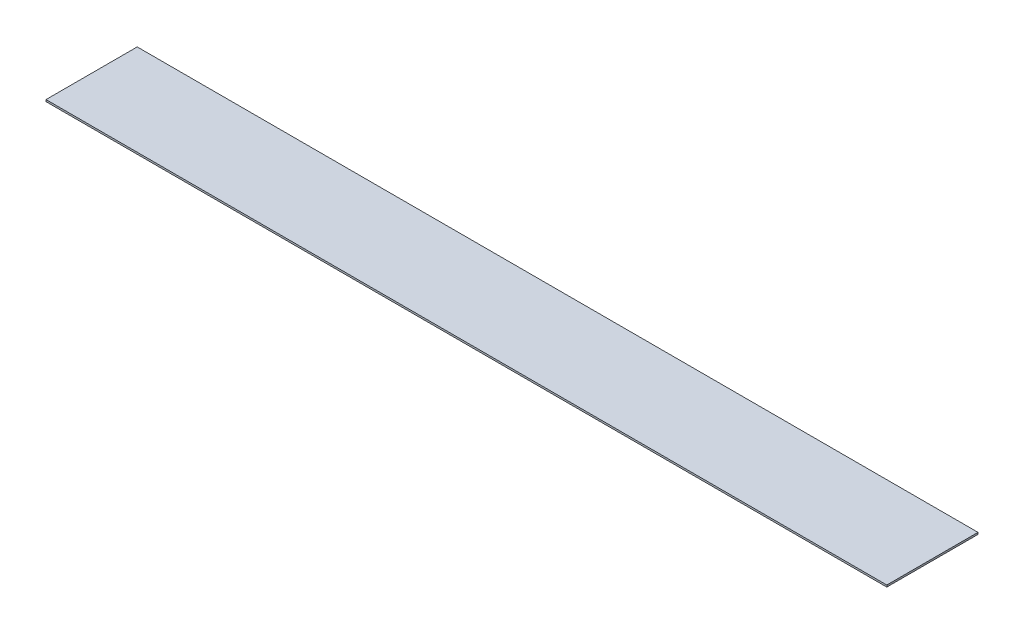
ISO-10303-21;
HEADER;
FILE_DESCRIPTION(('STEP AP214'),'2;1');
FILE_NAME('part.step','',(''),(''),'','','');
FILE_SCHEMA(('AUTOMOTIVE_DESIGN { 1 0 10303 214 1 1 1 1 }'));
ENDSEC;
DATA;
#1=APPLICATION_CONTEXT('core data for automotive mechanical design processes');
#2=APPLICATION_PROTOCOL_DEFINITION('international standard','automotive_design',2000,#1);
#3=PRODUCT_CONTEXT('',#1,'mechanical');
#4=PRODUCT('Part','Part','',(#3));
#5=PRODUCT_RELATED_PRODUCT_CATEGORY('part','',(#4));
#6=PRODUCT_DEFINITION_FORMATION('','',#4);
#7=PRODUCT_DEFINITION_CONTEXT('part definition',#1,'design');
#8=PRODUCT_DEFINITION('design','',#6,#7);
#9=PRODUCT_DEFINITION_SHAPE('','',#8);
#10=(LENGTH_UNIT() NAMED_UNIT(*) SI_UNIT(.MILLI.,.METRE.));
#11=(NAMED_UNIT(*) PLANE_ANGLE_UNIT() SI_UNIT($,.RADIAN.));
#12=(NAMED_UNIT(*) SI_UNIT($,.STERADIAN.) SOLID_ANGLE_UNIT());
#13=UNCERTAINTY_MEASURE_WITH_UNIT(LENGTH_MEASURE(1.E-05),#10,'distance_accuracy_value','');
#14=(GEOMETRIC_REPRESENTATION_CONTEXT(3) GLOBAL_UNCERTAINTY_ASSIGNED_CONTEXT((#13)) GLOBAL_UNIT_ASSIGNED_CONTEXT((#10,
#11,#12)) REPRESENTATION_CONTEXT('',''));
#15=CARTESIAN_POINT('',(0.,0.,0.));
#16=DIRECTION('',(0.,0.,1.));
#17=DIRECTION('',(1.,0.,0.));
#18=AXIS2_PLACEMENT_3D('',#15,#16,#17);
#19=CARTESIAN_POINT('',(-461.,2.,-100.));
#20=DIRECTION('',(1.,0.,0.));
#21=DIRECTION('',(0.,0.,-1.));
#22=AXIS2_PLACEMENT_3D('',#19,#20,#21);
#23=PLANE('',#22);
#24=DIRECTION('',(0.,0.,1.));
#25=VECTOR('',#24,1.);
#26=CARTESIAN_POINT('',(-461.,0.,-100.));
#27=LINE('',#26,#25);
#28=CARTESIAN_POINT('',(-461.,0.,-100.));
#29=VERTEX_POINT('',#28);
#30=CARTESIAN_POINT('',(-461.,0.,0.));
#31=VERTEX_POINT('',#30);
#32=EDGE_CURVE('E98',#29,#31,#27,.T.);
#33=ORIENTED_EDGE('',*,*,#32,.T.);
#34=DIRECTION('',(0.,-1.,0.));
#35=VECTOR('',#34,1.);
#36=CARTESIAN_POINT('',(-461.,2.,0.));
#37=LINE('',#36,#35);
#38=CARTESIAN_POINT('',(-461.,2.,0.));
#39=VERTEX_POINT('',#38);
#40=EDGE_CURVE('E11',#39,#31,#37,.T.);
#41=ORIENTED_EDGE('',*,*,#40,.F.);
#42=DIRECTION('',(0.,0.,1.));
#43=VECTOR('',#42,1.);
#44=CARTESIAN_POINT('',(-461.,2.,-100.));
#45=LINE('',#44,#43);
#46=CARTESIAN_POINT('',(-461.,2.,-100.));
#47=VERTEX_POINT('',#46);
#48=EDGE_CURVE('E86',#47,#39,#45,.T.);
#49=ORIENTED_EDGE('',*,*,#48,.F.);
#50=DIRECTION('',(0.,-1.,0.));
#51=VECTOR('',#50,1.);
#52=CARTESIAN_POINT('',(-461.,2.,-100.));
#53=LINE('',#52,#51);
#54=EDGE_CURVE('E94',#47,#29,#53,.T.);
#55=ORIENTED_EDGE('',*,*,#54,.T.);
#56=EDGE_LOOP('',(#33,#41,#49,#55));
#57=FACE_BOUND('',#56,.T.);
#58=ADVANCED_FACE('F35',(#57),#23,.F.);
#59=CARTESIAN_POINT('',(-461.,2.,0.));
#60=DIRECTION('',(0.,0.,-1.));
#61=DIRECTION('',(-1.,0.,0.));
#62=AXIS2_PLACEMENT_3D('',#59,#60,#61);
#63=PLANE('',#62);
#64=DIRECTION('',(1.,0.,0.));
#65=VECTOR('',#64,1.);
#66=CARTESIAN_POINT('',(-461.,0.,0.));
#67=LINE('',#66,#65);
#68=CARTESIAN_POINT('',(461.,0.,-1.69368652322079E-13));
#69=VERTEX_POINT('',#68);
#70=EDGE_CURVE('E90',#31,#69,#67,.T.);
#71=ORIENTED_EDGE('',*,*,#70,.T.);
#72=DIRECTION('',(0.,-1.,0.));
#73=VECTOR('',#72,1.);
#74=CARTESIAN_POINT('',(461.,2.,-1.69368652322079E-13));
#75=LINE('',#74,#73);
#76=CARTESIAN_POINT('',(461.,2.,-1.69368652322079E-13));
#77=VERTEX_POINT('',#76);
#78=EDGE_CURVE('E43',#77,#69,#75,.T.);
#79=ORIENTED_EDGE('',*,*,#78,.F.);
#80=DIRECTION('',(1.,0.,0.));
#81=VECTOR('',#80,1.);
#82=CARTESIAN_POINT('',(-461.,2.,0.));
#83=LINE('',#82,#81);
#84=EDGE_CURVE('E81',#39,#77,#83,.T.);
#85=ORIENTED_EDGE('',*,*,#84,.F.);
#86=ORIENTED_EDGE('',*,*,#40,.T.);
#87=EDGE_LOOP('',(#71,#79,#85,#86));
#88=FACE_BOUND('',#87,.T.);
#89=ADVANCED_FACE('F89',(#88),#63,.F.);
#90=CARTESIAN_POINT('',(461.,2.,-100.));
#91=DIRECTION('',(-1.,0.,0.));
#92=DIRECTION('',(0.,0.,1.));
#93=AXIS2_PLACEMENT_3D('',#90,#91,#92);
#94=PLANE('',#93);
#95=DIRECTION('',(0.,0.,-1.));
#96=VECTOR('',#95,1.);
#97=CARTESIAN_POINT('',(461.,0.,-100.));
#98=LINE('',#97,#96);
#99=CARTESIAN_POINT('',(461.,0.,-100.));
#100=VERTEX_POINT('',#99);
#101=EDGE_CURVE('E68',#69,#100,#98,.T.);
#102=ORIENTED_EDGE('',*,*,#101,.T.);
#103=DIRECTION('',(0.,-1.,0.));
#104=VECTOR('',#103,1.);
#105=CARTESIAN_POINT('',(461.,2.,-100.));
#106=LINE('',#105,#104);
#107=CARTESIAN_POINT('',(461.,2.,-100.));
#108=VERTEX_POINT('',#107);
#109=EDGE_CURVE('E91',#108,#100,#106,.T.);
#110=ORIENTED_EDGE('',*,*,#109,.F.);
#111=DIRECTION('',(0.,0.,-1.));
#112=VECTOR('',#111,1.);
#113=CARTESIAN_POINT('',(461.,2.,-100.));
#114=LINE('',#113,#112);
#115=EDGE_CURVE('E84',#77,#108,#114,.T.);
#116=ORIENTED_EDGE('',*,*,#115,.F.);
#117=ORIENTED_EDGE('',*,*,#78,.T.);
#118=EDGE_LOOP('',(#102,#110,#116,#117));
#119=FACE_BOUND('',#118,.T.);
#120=ADVANCED_FACE('F92',(#119),#94,.F.);
#121=CARTESIAN_POINT('',(-461.,2.,-100.));
#122=DIRECTION('',(0.,0.,1.));
#123=DIRECTION('',(1.,0.,0.));
#124=AXIS2_PLACEMENT_3D('',#121,#122,#123);
#125=PLANE('',#124);
#126=DIRECTION('',(-1.,0.,0.));
#127=VECTOR('',#126,1.);
#128=CARTESIAN_POINT('',(-461.,0.,-100.));
#129=LINE('',#128,#127);
#130=EDGE_CURVE('E74',#100,#29,#129,.T.);
#131=ORIENTED_EDGE('',*,*,#130,.T.);
#132=ORIENTED_EDGE('',*,*,#54,.F.);
#133=DIRECTION('',(-1.,0.,0.));
#134=VECTOR('',#133,1.);
#135=CARTESIAN_POINT('',(-461.,2.,-100.));
#136=LINE('',#135,#134);
#137=EDGE_CURVE('E51',#108,#47,#136,.T.);
#138=ORIENTED_EDGE('',*,*,#137,.F.);
#139=ORIENTED_EDGE('',*,*,#109,.T.);
#140=EDGE_LOOP('',(#131,#132,#138,#139));
#141=FACE_BOUND('',#140,.T.);
#142=ADVANCED_FACE('F105',(#141),#125,.F.);
#143=CARTESIAN_POINT('',(0.,2.,0.));
#144=DIRECTION('',(0.,1.,0.));
#145=DIRECTION('',(0.,0.,1.));
#146=AXIS2_PLACEMENT_3D('',#143,#144,#145);
#147=PLANE('',#146);
#148=ORIENTED_EDGE('',*,*,#48,.T.);
#149=ORIENTED_EDGE('',*,*,#84,.T.);
#150=ORIENTED_EDGE('',*,*,#115,.T.);
#151=ORIENTED_EDGE('',*,*,#137,.T.);
#152=EDGE_LOOP('',(#148,#149,#150,#151));
#153=FACE_BOUND('',#152,.T.);
#154=ADVANCED_FACE('F82',(#153),#147,.T.);
#155=CARTESIAN_POINT('',(0.,0.,0.));
#156=DIRECTION('',(0.,1.,0.));
#157=DIRECTION('',(0.,0.,1.));
#158=AXIS2_PLACEMENT_3D('',#155,#156,#157);
#159=PLANE('',#158);
#160=ORIENTED_EDGE('',*,*,#32,.F.);
#161=ORIENTED_EDGE('',*,*,#130,.F.);
#162=ORIENTED_EDGE('',*,*,#101,.F.);
#163=ORIENTED_EDGE('',*,*,#70,.F.);
#164=EDGE_LOOP('',(#160,#161,#162,#163));
#165=FACE_BOUND('',#164,.T.);
#166=ADVANCED_FACE('F108',(#165),#159,.F.);
#167=CLOSED_SHELL('',(#58,#89,#120,#142,#154,#166));
#168=MANIFOLD_SOLID_BREP('B2',#167);
#169=ADVANCED_BREP_SHAPE_REPRESENTATION('',(#18,#168),#14);
#170=SHAPE_DEFINITION_REPRESENTATION(#9,#169);
ENDSEC;
END-ISO-10303-21;
